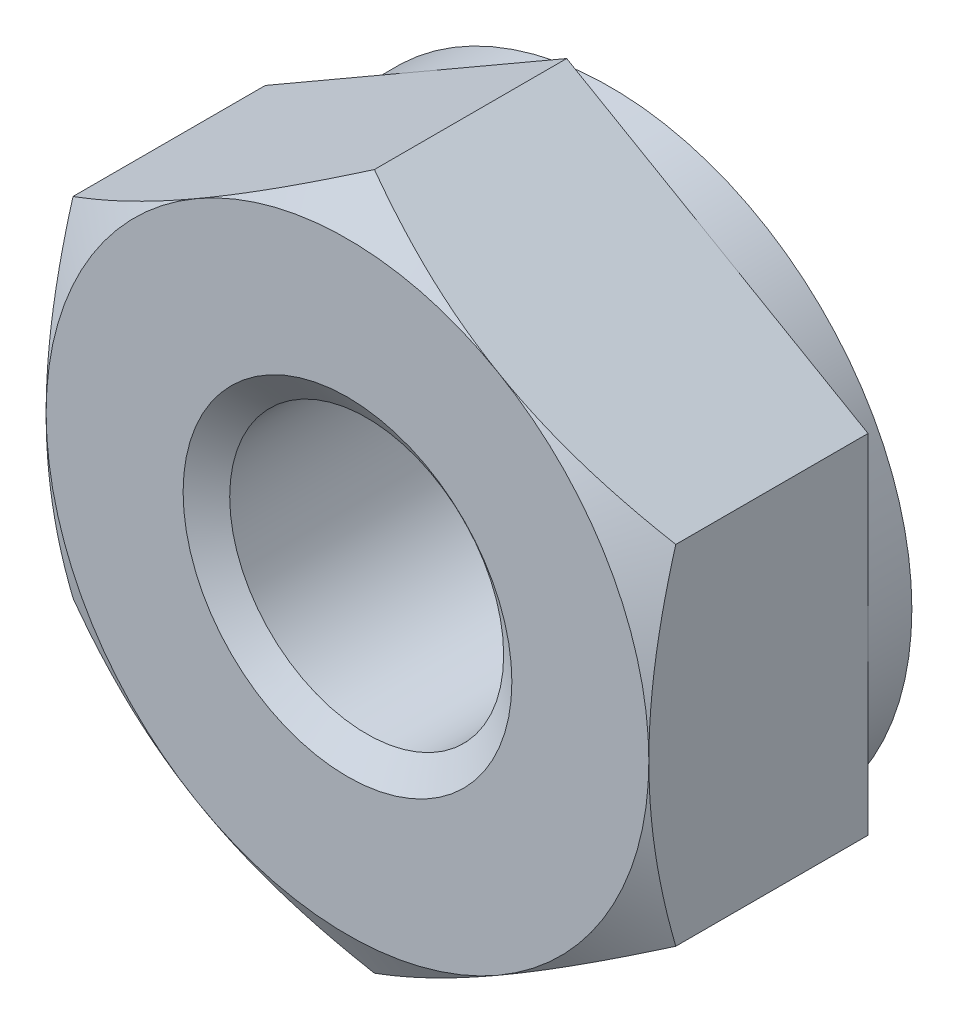
ISO-10303-21;
HEADER;
FILE_DESCRIPTION(('STEP AP214'),'2;1');
FILE_NAME('part.step','',(''),(''),'','','');
FILE_SCHEMA(('AUTOMOTIVE_DESIGN { 1 0 10303 214 1 1 1 1 }'));
ENDSEC;
DATA;
#1=APPLICATION_CONTEXT('core data for automotive mechanical design processes');
#2=APPLICATION_PROTOCOL_DEFINITION('international standard','automotive_design',2000,#1);
#3=PRODUCT_CONTEXT('',#1,'mechanical');
#4=PRODUCT('Part','Part','',(#3));
#5=PRODUCT_RELATED_PRODUCT_CATEGORY('part','',(#4));
#6=PRODUCT_DEFINITION_FORMATION('','',#4);
#7=PRODUCT_DEFINITION_CONTEXT('part definition',#1,'design');
#8=PRODUCT_DEFINITION('design','',#6,#7);
#9=PRODUCT_DEFINITION_SHAPE('','',#8);
#10=(LENGTH_UNIT() NAMED_UNIT(*) SI_UNIT(.MILLI.,.METRE.));
#11=(NAMED_UNIT(*) PLANE_ANGLE_UNIT() SI_UNIT($,.RADIAN.));
#12=(NAMED_UNIT(*) SI_UNIT($,.STERADIAN.) SOLID_ANGLE_UNIT());
#13=UNCERTAINTY_MEASURE_WITH_UNIT(LENGTH_MEASURE(1.E-05),#10,'distance_accuracy_value','');
#14=(GEOMETRIC_REPRESENTATION_CONTEXT(3) GLOBAL_UNCERTAINTY_ASSIGNED_CONTEXT((#13)) GLOBAL_UNIT_ASSIGNED_CONTEXT((#10,
#11,#12)) REPRESENTATION_CONTEXT('',''));
#15=CARTESIAN_POINT('',(0.,0.,0.));
#16=DIRECTION('',(0.,0.,1.));
#17=DIRECTION('',(1.,0.,0.));
#18=AXIS2_PLACEMENT_3D('',#15,#16,#17);
#19=CARTESIAN_POINT('',(0.,0.,-2.4));
#20=DIRECTION('',(0.,0.,1.));
#21=DIRECTION('',(1.,0.,0.));
#22=AXIS2_PLACEMENT_3D('',#19,#20,#21);
#23=CYLINDRICAL_SURFACE('',#22,1.25);
#24=CARTESIAN_POINT('',(0.,0.,-0.175051884552426));
#25=DIRECTION('',(0.,0.,1.));
#26=DIRECTION('',(1.,0.,0.));
#27=AXIS2_PLACEMENT_3D('',#24,#25,#26);
#28=CIRCLE('',#27,1.25);
#29=CARTESIAN_POINT('',(1.25,0.,-0.175051884552426));
#30=VERTEX_POINT('',#29);
#31=EDGE_CURVE('E152',#30,#30,#28,.F.);
#32=ORIENTED_EDGE('',*,*,#31,.F.);
#33=EDGE_LOOP('',(#32));
#34=FACE_BOUND('',#33,.T.);
#35=CARTESIAN_POINT('',(0.,0.,-2.19954811544757));
#36=DIRECTION('',(0.,0.,-1.));
#37=DIRECTION('',(-1.,0.,0.));
#38=AXIS2_PLACEMENT_3D('',#35,#36,#37);
#39=CIRCLE('',#38,1.25);
#40=CARTESIAN_POINT('',(-1.25,0.,-2.19954811544757));
#41=VERTEX_POINT('',#40);
#42=EDGE_CURVE('E40',#41,#41,#39,.F.);
#43=ORIENTED_EDGE('',*,*,#42,.F.);
#44=EDGE_LOOP('',(#43));
#45=FACE_BOUND('',#44,.T.);
#46=ADVANCED_FACE('F35',(#34,#45),#23,.F.);
#47=CARTESIAN_POINT('',(0.,3.17542648054294,-2.4));
#48=DIRECTION('',(-0.500000000000001,0.866025403784438,0.));
#49=DIRECTION('',(-0.866025403784438,-0.500000000000001,0.));
#50=AXIS2_PLACEMENT_3D('',#47,#48,#49);
#51=PLANE('',#50);
#52=DIRECTION('',(0.,0.,1.));
#53=VECTOR('',#52,1.);
#54=CARTESIAN_POINT('',(-2.75,1.58771324027147,-2.4));
#55=LINE('',#54,#53);
#56=CARTESIAN_POINT('',(-2.75,1.58771324027147,-2.));
#57=VERTEX_POINT('',#56);
#58=CARTESIAN_POINT('',(-2.75,1.58771324027147,-0.245620093061864));
#59=VERTEX_POINT('',#58);
#60=EDGE_CURVE('E290',#57,#59,#55,.T.);
#61=ORIENTED_EDGE('',*,*,#60,.T.);
#62=CARTESIAN_POINT('',(-2.7502,1.58759777021763,-0.245686763364761));
#63=CARTESIAN_POINT('',(-2.62935077934009,1.65737010029698,-0.205387662249264));
#64=CARTESIAN_POINT('',(-2.50745839737737,1.72774469983533,-0.168736902597662));
#65=CARTESIAN_POINT('',(-2.26156287327211,1.86971254687003,-0.104762182969801));
#66=CARTESIAN_POINT('',(-2.13755536142614,1.94130831721583,-0.077460855674497));
#67=CARTESIAN_POINT('',(-1.89107720202406,2.08361254889599,-0.0349617452941163));
#68=CARTESIAN_POINT('',(-1.76864448141258,2.15429911309864,-0.0194811186224573));
#69=CARTESIAN_POINT('',(-1.52320285763108,2.29600490065923,-0.000999397369939996));
#70=CARTESIAN_POINT('',(-1.40019484676709,2.36702360884404,0.00201700053740086));
#71=CARTESIAN_POINT('',(-1.17034121338921,2.49972966594897,-0.00425314542854626));
#72=CARTESIAN_POINT('',(-1.06346120874598,2.56143686540073,-0.0120001542767021));
#73=CARTESIAN_POINT('',(-0.85039753266525,2.68444923614047,-0.0365551810643548));
#74=CARTESIAN_POINT('',(-0.744214598351111,2.74575398185008,-0.0533715896505704));
#75=CARTESIAN_POINT('',(-0.530711510606816,2.86902004703206,-0.0954119223459566));
#76=CARTESIAN_POINT('',(-0.423418383857145,2.93096576264318,-0.120814080687231));
#77=CARTESIAN_POINT('',(-0.210432520715949,3.05393320806134,-0.178467225839983));
#78=CARTESIAN_POINT('',(-0.104737054973347,3.11495651365995,-0.210704663298983));
#79=CARTESIAN_POINT('',(0.000199999999999481,3.17554195059678,-0.245686763364762));
#80=B_SPLINE_CURVE_WITH_KNOTS('',3,(#62,#63,#64,#65,#66,#67,#68,#69,#70,#71,#72,#73,#74,#75,#76,
#77,#78,#79),.UNSPECIFIED.,.F.,.F.,(4,2,2,2,2,2,2,2,4),(0.,0.435912828725888,0.872873557116333,
1.29901931904672,1.72464171213574,2.09526089052938,2.46622354066374,2.84541551798557,
3.22386274754524),.UNSPECIFIED.);
#81=CARTESIAN_POINT('',(-1.375,2.38156986040721,0.));
#82=VERTEX_POINT('',#81);
#83=EDGE_CURVE('E138',#59,#82,#80,.T.);
#84=ORIENTED_EDGE('',*,*,#83,.T.);
#85=CARTESIAN_POINT('',(0.,3.17542648054294,-0.245620093061864));
#86=VERTEX_POINT('',#85);
#87=EDGE_CURVE('E165',#82,#86,#80,.T.);
#88=ORIENTED_EDGE('',*,*,#87,.T.);
#89=DIRECTION('',(0.,0.,1.));
#90=VECTOR('',#89,1.);
#91=CARTESIAN_POINT('',(0.,3.17542648054294,-2.4));
#92=LINE('',#91,#90);
#93=CARTESIAN_POINT('',(0.,3.17542648054294,-2.));
#94=VERTEX_POINT('',#93);
#95=EDGE_CURVE('E278',#94,#86,#92,.T.);
#96=ORIENTED_EDGE('',*,*,#95,.F.);
#97=DIRECTION('',(-0.866025403784438,-0.500000000000001,0.));
#98=VECTOR('',#97,1.);
#99=CARTESIAN_POINT('',(0.,3.17542648054294,-2.));
#100=LINE('',#99,#98);
#101=CARTESIAN_POINT('',(-1.375,2.3815698604072,-2.));
#102=VERTEX_POINT('',#101);
#103=EDGE_CURVE('E266',#94,#102,#100,.T.);
#104=ORIENTED_EDGE('',*,*,#103,.T.);
#105=EDGE_CURVE('E262',#102,#57,#100,.T.);
#106=ORIENTED_EDGE('',*,*,#105,.T.);
#107=EDGE_LOOP('',(#61,#84,#88,#96,#104,#106));
#108=FACE_BOUND('',#107,.T.);
#109=ADVANCED_FACE('F37',(#108),#51,.T.);
#110=CARTESIAN_POINT('',(2.75,1.58771324027147,-2.4));
#111=DIRECTION('',(0.5,0.866025403784439,0.));
#112=DIRECTION('',(-0.866025403784439,0.5,0.));
#113=AXIS2_PLACEMENT_3D('',#110,#111,#112);
#114=PLANE('',#113);
#115=ORIENTED_EDGE('',*,*,#95,.T.);
#116=CARTESIAN_POINT('',(-0.000200000000000393,3.17554195059678,-0.245686763364762));
#117=CARTESIAN_POINT('',(0.120649220659906,3.10576962051743,-0.205387662249264));
#118=CARTESIAN_POINT('',(0.242541602622633,3.03539502097908,-0.168736902597663));
#119=CARTESIAN_POINT('',(0.488437126727892,2.89342717394439,-0.104762182969801));
#120=CARTESIAN_POINT('',(0.612444638573856,2.82183140359858,-0.0774608556744977));
#121=CARTESIAN_POINT('',(0.858922797975944,2.67952717191842,-0.0349617452941169));
#122=CARTESIAN_POINT('',(0.981355518587418,2.60884060771577,-0.0194811186224577));
#123=CARTESIAN_POINT('',(1.22679714236892,2.46713482015518,-0.000999397369940226));
#124=CARTESIAN_POINT('',(1.34980515323291,2.39611611197038,0.0020170005374006));
#125=CARTESIAN_POINT('',(1.57965878661079,2.26341005486544,-0.00425314542854649));
#126=CARTESIAN_POINT('',(1.68653879125402,2.20170285541369,-0.0120001542767023));
#127=CARTESIAN_POINT('',(1.89960246733475,2.07869048467395,-0.0365551810643548));
#128=CARTESIAN_POINT('',(2.00578540164889,2.01738573896433,-0.0533715896505703));
#129=CARTESIAN_POINT('',(2.21928848939318,1.89411967378235,-0.0954119223459566));
#130=CARTESIAN_POINT('',(2.32658161614286,1.83217395817123,-0.120814080687231));
#131=CARTESIAN_POINT('',(2.53956747928405,1.70920651275308,-0.178467225839983));
#132=CARTESIAN_POINT('',(2.64526294502665,1.64818320715446,-0.210704663298983));
#133=CARTESIAN_POINT('',(2.7502,1.58759777021763,-0.245686763364761));
#134=B_SPLINE_CURVE_WITH_KNOTS('',3,(#116,#117,#118,#119,#120,#121,#122,#123,#124,#125,#126,
#127,#128,#129,#130,#131,#132,#133),.UNSPECIFIED.,.F.,.F.,(4,2,2,2,2,2,2,2,4),(0.,
0.435912828725889,0.872873557116333,1.29901931904672,1.72464171213574,2.09526089052938,
2.46622354066375,2.84541551798557,3.22386274754524),.UNSPECIFIED.);
#135=CARTESIAN_POINT('',(1.375,2.38156986040721,0.));
#136=VERTEX_POINT('',#135);
#137=EDGE_CURVE('E161',#86,#136,#134,.T.);
#138=ORIENTED_EDGE('',*,*,#137,.T.);
#139=CARTESIAN_POINT('',(2.75,1.58771324027147,-0.245620093061864));
#140=VERTEX_POINT('',#139);
#141=EDGE_CURVE('E147',#136,#140,#134,.T.);
#142=ORIENTED_EDGE('',*,*,#141,.T.);
#143=DIRECTION('',(0.,0.,1.));
#144=VECTOR('',#143,1.);
#145=CARTESIAN_POINT('',(2.75,1.58771324027147,-2.4));
#146=LINE('',#145,#144);
#147=CARTESIAN_POINT('',(2.75,1.58771324027147,-2.));
#148=VERTEX_POINT('',#147);
#149=EDGE_CURVE('E160',#148,#140,#146,.T.);
#150=ORIENTED_EDGE('',*,*,#149,.F.);
#151=DIRECTION('',(-0.866025403784439,0.5,0.));
#152=VECTOR('',#151,1.);
#153=CARTESIAN_POINT('',(2.75,1.58771324027147,-2.));
#154=LINE('',#153,#152);
#155=CARTESIAN_POINT('',(1.375,2.38156986040721,-2.));
#156=VERTEX_POINT('',#155);
#157=EDGE_CURVE('E274',#148,#156,#154,.T.);
#158=ORIENTED_EDGE('',*,*,#157,.T.);
#159=EDGE_CURVE('E270',#156,#94,#154,.T.);
#160=ORIENTED_EDGE('',*,*,#159,.T.);
#161=EDGE_LOOP('',(#115,#138,#142,#150,#158,#160));
#162=FACE_BOUND('',#161,.T.);
#163=ADVANCED_FACE('F237',(#162),#114,.T.);
#164=CARTESIAN_POINT('',(2.75,1.58771324027147,-2.4));
#165=DIRECTION('',(-1.,0.,0.));
#166=DIRECTION('',(0.,0.,1.));
#167=AXIS2_PLACEMENT_3D('',#164,#165,#166);
#168=PLANE('',#167);
#169=CARTESIAN_POINT('',(2.75,-4.21084949309676,-1.31594843960294));
#170=CARTESIAN_POINT('',(2.75,-4.0901089421409,-1.25759993615224));
#171=CARTESIAN_POINT('',(2.75,-3.96908292065509,-1.19983146511759));
#172=CARTESIAN_POINT('',(2.75,-3.72630558284843,-1.08578603842305));
#173=CARTESIAN_POINT('',(2.75,-3.604554145362,-1.02950934100247));
#174=CARTESIAN_POINT('',(2.75,-3.35951393034354,-0.918482443352757));
#175=CARTESIAN_POINT('',(2.75,-3.23622034236436,-0.863742821605838));
#176=CARTESIAN_POINT('',(2.75,-2.98861980138743,-0.756614777476454));
#177=CARTESIAN_POINT('',(2.75,-2.86431290161182,-0.704226232536763));
#178=CARTESIAN_POINT('',(2.75,-2.61294485887172,-0.601803572146123));
#179=CARTESIAN_POINT('',(2.75,-2.48586863815654,-0.551806257898393));
#180=CARTESIAN_POINT('',(2.75,-2.23021732171541,-0.455727408784601));
#181=CARTESIAN_POINT('',(2.75,-2.10164206103363,-0.409646309576971));
#182=CARTESIAN_POINT('',(2.75,-1.84305218799467,-0.322638077046231));
#183=CARTESIAN_POINT('',(2.75,-1.71304130052583,-0.281699986413888));
#184=CARTESIAN_POINT('',(2.75,-1.45117125062147,-0.206307307624348));
#185=CARTESIAN_POINT('',(2.75,-1.31931268690202,-0.171850669152767));
#186=CARTESIAN_POINT('',(2.75,-1.05365722480012,-0.111093671530904));
#187=CARTESIAN_POINT('',(2.75,-0.91985982021759,-0.0847954840951211));
#188=CARTESIAN_POINT('',(2.75,-0.650651874037379,-0.0421260371966109));
#189=CARTESIAN_POINT('',(2.75,-0.515241331013593,-0.025754786510543));
#190=CARTESIAN_POINT('',(2.75,-0.244373242869209,-0.00438749654023752));
#191=CARTESIAN_POINT('',(2.75,-0.108921526377132,0.000680556773215963));
#192=CARTESIAN_POINT('',(2.75,0.161887058855136,-0.000827795632672015));
#193=CARTESIAN_POINT('',(2.75,0.297243943089642,-0.00740117868555385));
#194=CARTESIAN_POINT('',(2.75,0.528385436717545,-0.0281041300468441));
#195=CARTESIAN_POINT('',(2.75,0.624425050137503,-0.0395376410301885));
#196=CARTESIAN_POINT('',(2.75,0.815762399811546,-0.0675217196133514));
#197=CARTESIAN_POINT('',(2.75,0.911060016631968,-0.0840730942276827));
#198=CARTESIAN_POINT('',(2.75,1.19576218748917,-0.140535361278285));
#199=CARTESIAN_POINT('',(2.75,1.38383224738497,-0.187239859417294));
#200=CARTESIAN_POINT('',(2.75,1.66525048947485,-0.267792497030579));
#201=CARTESIAN_POINT('',(2.75,1.76006556248558,-0.296803334995502));
#202=CARTESIAN_POINT('',(2.75,1.94870609382215,-0.357695648906589));
#203=CARTESIAN_POINT('',(2.75,2.04253218553696,-0.389575144878505));
#204=CARTESIAN_POINT('',(2.75,2.22880240354985,-0.455541418186449));
#205=CARTESIAN_POINT('',(2.75,2.32125133588452,-0.489614761455534));
#206=CARTESIAN_POINT('',(2.75,2.50543192042629,-0.559761368231111));
#207=CARTESIAN_POINT('',(2.75,2.59716326539579,-0.595835440037319));
#208=CARTESIAN_POINT('',(2.75,2.68856293053346,-0.632712441997485));
#209=B_SPLINE_CURVE_WITH_KNOTS('',3,(#169,#170,#171,#172,#173,#174,#175,#176,#177,#178,#179,
#180,#181,#182,#183,#184,#185,#186,#187,#188,#189,#190,#191,#192,#193,#194,#195,#196,#197,#198,
#199,#200,#201,#202,#203,#204,#205,#206,#207,#208),.UNSPECIFIED.,.F.,.F.,(4,2,2,2,2,2,2,2,2,2,2,
2,2,2,2,2,2,2,2,4),(0.,0.402305607365937,0.804680408536998,1.20935783819118,1.61401414820818,
2.0236383818577,2.43330812457349,2.842089694796,3.25074173456636,3.65950246109143,
4.06826354901184,4.4744128402465,4.88045669141172,5.17046846817546,5.46052599902452,
6.04107275309883,6.33851131304661,6.63574613017455,6.93130791005792,7.22698998004823),.UNSPECIFIED.);
#210=CARTESIAN_POINT('',(2.75,-1.58771324027147,-0.245620093061864));
#211=VERTEX_POINT('',#210);
#212=CARTESIAN_POINT('',(2.75,0.,0.));
#213=VERTEX_POINT('',#212);
#214=EDGE_CURVE('E127',#211,#213,#209,.T.);
#215=ORIENTED_EDGE('',*,*,#214,.F.);
#216=DIRECTION('',(0.,0.,1.));
#217=VECTOR('',#216,1.);
#218=CARTESIAN_POINT('',(2.75,-1.58771324027147,-2.4));
#219=LINE('',#218,#217);
#220=CARTESIAN_POINT('',(2.75,-1.58771324027147,-2.));
#221=VERTEX_POINT('',#220);
#222=EDGE_CURVE('E283',#221,#211,#219,.T.);
#223=ORIENTED_EDGE('',*,*,#222,.F.);
#224=DIRECTION('',(0.,-1.,0.));
#225=VECTOR('',#224,1.);
#226=CARTESIAN_POINT('',(2.75,1.58771324027147,-2.));
#227=LINE('',#226,#225);
#228=CARTESIAN_POINT('',(2.75,0.,-2.));
#229=VERTEX_POINT('',#228);
#230=EDGE_CURVE('E275',#229,#221,#227,.T.);
#231=ORIENTED_EDGE('',*,*,#230,.F.);
#232=EDGE_CURVE('E277',#148,#229,#227,.T.);
#233=ORIENTED_EDGE('',*,*,#232,.F.);
#234=ORIENTED_EDGE('',*,*,#149,.T.);
#235=EDGE_CURVE('E140',#213,#140,#209,.T.);
#236=ORIENTED_EDGE('',*,*,#235,.F.);
#237=EDGE_LOOP('',(#215,#223,#231,#233,#234,#236));
#238=FACE_BOUND('',#237,.T.);
#239=ADVANCED_FACE('F157',(#238),#168,.F.);
#240=CARTESIAN_POINT('',(0.,-3.17542648054295,-2.4));
#241=DIRECTION('',(0.500000000000001,-0.866025403784438,0.));
#242=DIRECTION('',(0.866025403784438,0.500000000000001,0.));
#243=AXIS2_PLACEMENT_3D('',#240,#241,#242);
#244=PLANE('',#243);
#245=ORIENTED_EDGE('',*,*,#222,.T.);
#246=CARTESIAN_POINT('',(2.7502,-1.58759777021763,-0.245686763364761));
#247=CARTESIAN_POINT('',(2.62935077934009,-1.65737010029699,-0.205387662249264));
#248=CARTESIAN_POINT('',(2.50745839737737,-1.72774469983533,-0.168736902597663));
#249=CARTESIAN_POINT('',(2.26156287327211,-1.86971254687003,-0.104762182969802));
#250=CARTESIAN_POINT('',(2.13755536142614,-1.94130831721583,-0.0774608556744979));
#251=CARTESIAN_POINT('',(1.89107720202406,-2.08361254889599,-0.0349617452941172));
#252=CARTESIAN_POINT('',(1.76864448141258,-2.15429911309864,-0.0194811186224582));
#253=CARTESIAN_POINT('',(1.52320285763108,-2.29600490065923,-0.000999397369941026));
#254=CARTESIAN_POINT('',(1.40019484676709,-2.36702360884404,0.00201700053739964));
#255=CARTESIAN_POINT('',(1.17034121338921,-2.49972966594897,-0.00425314542854765));
#256=CARTESIAN_POINT('',(1.06346120874598,-2.56143686540073,-0.0120001542767035));
#257=CARTESIAN_POINT('',(0.85039753266525,-2.68444923614047,-0.0365551810643563));
#258=CARTESIAN_POINT('',(0.744214598351111,-2.74575398185008,-0.0533715896505721));
#259=CARTESIAN_POINT('',(0.530711510606816,-2.86902004703207,-0.0954119223459584));
#260=CARTESIAN_POINT('',(0.423418383857145,-2.93096576264319,-0.120814080687233));
#261=CARTESIAN_POINT('',(0.210432520715949,-3.05393320806134,-0.178467225839984));
#262=CARTESIAN_POINT('',(0.104737054973348,-3.11495651365995,-0.210704663298985));
#263=CARTESIAN_POINT('',(-0.000199999999999358,-3.17554195059678,-0.245686763364763));
#264=B_SPLINE_CURVE_WITH_KNOTS('',3,(#246,#247,#248,#249,#250,#251,#252,#253,#254,#255,#256,
#257,#258,#259,#260,#261,#262,#263),.UNSPECIFIED.,.F.,.F.,(4,2,2,2,2,2,2,2,4),(0.,
0.435912828725889,0.872873557116333,1.29901931904672,1.72464171213574,2.09526089052938,
2.46622354066374,2.84541551798557,3.22386274754524),.UNSPECIFIED.);
#265=CARTESIAN_POINT('',(1.375,-2.38156986040721,0.));
#266=VERTEX_POINT('',#265);
#267=EDGE_CURVE('E133',#211,#266,#264,.T.);
#268=ORIENTED_EDGE('',*,*,#267,.T.);
#269=CARTESIAN_POINT('',(0.,-3.17542648054294,-0.245620093061864));
#270=VERTEX_POINT('',#269);
#271=EDGE_CURVE('E54',#266,#270,#264,.T.);
#272=ORIENTED_EDGE('',*,*,#271,.T.);
#273=DIRECTION('',(0.,0.,1.));
#274=VECTOR('',#273,1.);
#275=CARTESIAN_POINT('',(0.,-3.17542648054295,-2.4));
#276=LINE('',#275,#274);
#277=CARTESIAN_POINT('',(0.,-3.17542648054295,-2.));
#278=VERTEX_POINT('',#277);
#279=EDGE_CURVE('E285',#278,#270,#276,.T.);
#280=ORIENTED_EDGE('',*,*,#279,.F.);
#281=DIRECTION('',(0.866025403784438,0.500000000000001,0.));
#282=VECTOR('',#281,1.);
#283=CARTESIAN_POINT('',(0.,-3.17542648054295,-2.));
#284=LINE('',#283,#282);
#285=CARTESIAN_POINT('',(1.375,-2.38156986040721,-2.));
#286=VERTEX_POINT('',#285);
#287=EDGE_CURVE('E267',#278,#286,#284,.T.);
#288=ORIENTED_EDGE('',*,*,#287,.T.);
#289=EDGE_CURVE('E271',#286,#221,#284,.T.);
#290=ORIENTED_EDGE('',*,*,#289,.T.);
#291=EDGE_LOOP('',(#245,#268,#272,#280,#288,#290));
#292=FACE_BOUND('',#291,.T.);
#293=ADVANCED_FACE('F218',(#292),#244,.T.);
#294=CARTESIAN_POINT('',(-2.75,-1.58771324027147,-2.4));
#295=DIRECTION('',(-0.5,-0.866025403784439,0.));
#296=DIRECTION('',(0.866025403784439,-0.5,0.));
#297=AXIS2_PLACEMENT_3D('',#294,#295,#296);
#298=PLANE('',#297);
#299=ORIENTED_EDGE('',*,*,#279,.T.);
#300=CARTESIAN_POINT('',(0.000200000000000501,-3.17554195059678,-0.245686763364763));
#301=CARTESIAN_POINT('',(-0.120649220659906,-3.10576962051743,-0.205387662249265));
#302=CARTESIAN_POINT('',(-0.242541602622633,-3.03539502097908,-0.168736902597664));
#303=CARTESIAN_POINT('',(-0.488437126727893,-2.89342717394439,-0.104762182969802));
#304=CARTESIAN_POINT('',(-0.612444638573856,-2.82183140359859,-0.0774608556744989));
#305=CARTESIAN_POINT('',(-0.858922797975945,-2.67952717191843,-0.0349617452941181));
#306=CARTESIAN_POINT('',(-0.981355518587418,-2.60884060771577,-0.019481118622459));
#307=CARTESIAN_POINT('',(-1.22679714236892,-2.46713482015519,-0.000999397369941588));
#308=CARTESIAN_POINT('',(-1.34980515323291,-2.39611611197038,0.0020170005373991));
#309=CARTESIAN_POINT('',(-1.57965878661079,-2.26341005486544,-0.00425314542854787));
#310=CARTESIAN_POINT('',(-1.68653879125402,-2.20170285541369,-0.0120001542767034));
#311=CARTESIAN_POINT('',(-1.89960246733475,-2.07869048467395,-0.0365551810643559));
#312=CARTESIAN_POINT('',(-2.00578540164889,-2.01738573896434,-0.0533715896505716));
#313=CARTESIAN_POINT('',(-2.21928848939318,-1.89411967378235,-0.0954119223459577));
#314=CARTESIAN_POINT('',(-2.32658161614286,-1.83217395817123,-0.120814080687232));
#315=CARTESIAN_POINT('',(-2.53956747928405,-1.70920651275308,-0.178467225839983));
#316=CARTESIAN_POINT('',(-2.64526294502665,-1.64818320715446,-0.210704663298984));
#317=CARTESIAN_POINT('',(-2.7502,-1.58759777021764,-0.245686763364762));
#318=B_SPLINE_CURVE_WITH_KNOTS('',3,(#300,#301,#302,#303,#304,#305,#306,#307,#308,#309,#310,
#311,#312,#313,#314,#315,#316,#317),.UNSPECIFIED.,.F.,.F.,(4,2,2,2,2,2,2,2,4),(0.,
0.435912828725889,0.872873557116334,1.29901931904672,1.72464171213574,2.09526089052938,
2.46622354066374,2.84541551798557,3.22386274754524),.UNSPECIFIED.);
#319=CARTESIAN_POINT('',(-1.375,-2.38156986040721,0.));
#320=VERTEX_POINT('',#319);
#321=EDGE_CURVE('E212',#270,#320,#318,.T.);
#322=ORIENTED_EDGE('',*,*,#321,.T.);
#323=CARTESIAN_POINT('',(-2.75,-1.58771324027147,-0.245620093061864));
#324=VERTEX_POINT('',#323);
#325=EDGE_CURVE('E61',#320,#324,#318,.T.);
#326=ORIENTED_EDGE('',*,*,#325,.T.);
#327=DIRECTION('',(0.,0.,1.));
#328=VECTOR('',#327,1.);
#329=CARTESIAN_POINT('',(-2.75,-1.58771324027147,-2.4));
#330=LINE('',#329,#328);
#331=CARTESIAN_POINT('',(-2.75,-1.58771324027147,-2.));
#332=VERTEX_POINT('',#331);
#333=EDGE_CURVE('E288',#332,#324,#330,.T.);
#334=ORIENTED_EDGE('',*,*,#333,.F.);
#335=DIRECTION('',(0.866025403784439,-0.5,0.));
#336=VECTOR('',#335,1.);
#337=CARTESIAN_POINT('',(-2.75,-1.58771324027147,-2.));
#338=LINE('',#337,#336);
#339=CARTESIAN_POINT('',(-1.375,-2.38156986040721,-2.));
#340=VERTEX_POINT('',#339);
#341=EDGE_CURVE('E257',#332,#340,#338,.T.);
#342=ORIENTED_EDGE('',*,*,#341,.T.);
#343=EDGE_CURVE('E263',#340,#278,#338,.T.);
#344=ORIENTED_EDGE('',*,*,#343,.T.);
#345=EDGE_LOOP('',(#299,#322,#326,#334,#342,#344));
#346=FACE_BOUND('',#345,.T.);
#347=ADVANCED_FACE('F214',(#346),#298,.T.);
#348=CARTESIAN_POINT('',(-2.75,1.58771324027147,-2.4));
#349=DIRECTION('',(-1.,0.,0.));
#350=DIRECTION('',(0.,0.,1.));
#351=AXIS2_PLACEMENT_3D('',#348,#349,#350);
#352=PLANE('',#351);
#353=ORIENTED_EDGE('',*,*,#333,.T.);
#354=CARTESIAN_POINT('',(-2.75,-4.21084949309676,-1.31594843960294));
#355=CARTESIAN_POINT('',(-2.75,-4.0901089421409,-1.25759993615224));
#356=CARTESIAN_POINT('',(-2.75,-3.96908292065509,-1.19983146511759));
#357=CARTESIAN_POINT('',(-2.75,-3.72630558284844,-1.08578603842305));
#358=CARTESIAN_POINT('',(-2.75,-3.604554145362,-1.02950934100247));
#359=CARTESIAN_POINT('',(-2.75,-3.35951393034355,-0.918482443352758));
#360=CARTESIAN_POINT('',(-2.75,-3.23622034236436,-0.863742821605839));
#361=CARTESIAN_POINT('',(-2.75,-2.98861980138743,-0.756614777476455));
#362=CARTESIAN_POINT('',(-2.75,-2.86431290161182,-0.704226232536764));
#363=CARTESIAN_POINT('',(-2.75,-2.61294485887172,-0.601803572146124));
#364=CARTESIAN_POINT('',(-2.75,-2.48586863815654,-0.551806257898394));
#365=CARTESIAN_POINT('',(-2.75,-2.23021732171541,-0.455727408784601));
#366=CARTESIAN_POINT('',(-2.75,-2.10164206103363,-0.409646309576972));
#367=CARTESIAN_POINT('',(-2.75,-1.84305218799467,-0.322638077046231));
#368=CARTESIAN_POINT('',(-2.75,-1.71304130052583,-0.281699986413888));
#369=CARTESIAN_POINT('',(-2.75,-1.45117125062148,-0.206307307624348));
#370=CARTESIAN_POINT('',(-2.75,-1.31931268690202,-0.171850669152767));
#371=CARTESIAN_POINT('',(-2.75,-1.05365722480012,-0.111093671530904));
#372=CARTESIAN_POINT('',(-2.75,-0.919859820217591,-0.0847954840951213));
#373=CARTESIAN_POINT('',(-2.75,-0.65065187403738,-0.0421260371966111));
#374=CARTESIAN_POINT('',(-2.75,-0.515241331013594,-0.0257547865105431));
#375=CARTESIAN_POINT('',(-2.75,-0.24437324286921,-0.00438749654023746));
#376=CARTESIAN_POINT('',(-2.75,-0.108921526377132,0.000680556773216002));
#377=CARTESIAN_POINT('',(-2.75,0.161887058855135,-0.000827795632672053));
#378=CARTESIAN_POINT('',(-2.75,0.297243943089641,-0.00740117868555392));
#379=CARTESIAN_POINT('',(-2.75,0.528385436717543,-0.028104130046844));
#380=CARTESIAN_POINT('',(-2.75,0.624425050137501,-0.0395376410301884));
#381=CARTESIAN_POINT('',(-2.75,0.815762399811544,-0.067521719613351));
#382=CARTESIAN_POINT('',(-2.75,0.911060016631966,-0.0840730942276823));
#383=CARTESIAN_POINT('',(-2.75,1.19576218748916,-0.140535361278284));
#384=CARTESIAN_POINT('',(-2.75,1.38383224738497,-0.187239859417294));
#385=CARTESIAN_POINT('',(-2.75,1.66525048947485,-0.267792497030578));
#386=CARTESIAN_POINT('',(-2.75,1.76006556248558,-0.296803334995501));
#387=CARTESIAN_POINT('',(-2.75,1.94870609382215,-0.357695648906588));
#388=CARTESIAN_POINT('',(-2.75,2.04253218553696,-0.389575144878503));
#389=CARTESIAN_POINT('',(-2.75,2.22880240354984,-0.455541418186448));
#390=CARTESIAN_POINT('',(-2.75,2.32125133588451,-0.489614761455533));
#391=CARTESIAN_POINT('',(-2.75,2.50543192042629,-0.559761368231109));
#392=CARTESIAN_POINT('',(-2.75,2.59716326539579,-0.595835440037318));
#393=CARTESIAN_POINT('',(-2.75,2.68856293053346,-0.632712441997484));
#394=B_SPLINE_CURVE_WITH_KNOTS('',3,(#354,#355,#356,#357,#358,#359,#360,#361,#362,#363,#364,
#365,#366,#367,#368,#369,#370,#371,#372,#373,#374,#375,#376,#377,#378,#379,#380,#381,#382,#383,
#384,#385,#386,#387,#388,#389,#390,#391,#392,#393),.UNSPECIFIED.,.F.,.F.,(4,2,2,2,2,2,2,2,2,2,2,
2,2,2,2,2,2,2,2,4),(0.,0.402305607365936,0.804680408536997,1.20935783819118,1.61401414820818,
2.0236383818577,2.43330812457349,2.842089694796,3.25074173456636,3.65950246109144,
4.06826354901184,4.4744128402465,4.88045669141172,5.17046846817546,5.46052599902452,
6.04107275309883,6.33851131304661,6.63574613017455,6.93130791005792,7.22698998004822),.UNSPECIFIED.);
#395=CARTESIAN_POINT('',(-2.75,0.,0.));
#396=VERTEX_POINT('',#395);
#397=EDGE_CURVE('E213',#324,#396,#394,.T.);
#398=ORIENTED_EDGE('',*,*,#397,.T.);
#399=EDGE_CURVE('E151',#396,#59,#394,.T.);
#400=ORIENTED_EDGE('',*,*,#399,.T.);
#401=ORIENTED_EDGE('',*,*,#60,.F.);
#402=DIRECTION('',(0.,-1.,0.));
#403=VECTOR('',#402,1.);
#404=CARTESIAN_POINT('',(-2.75,1.58771324027147,-2.));
#405=LINE('',#404,#403);
#406=CARTESIAN_POINT('',(-2.75,0.,-2.));
#407=VERTEX_POINT('',#406);
#408=EDGE_CURVE('E297',#57,#407,#405,.T.);
#409=ORIENTED_EDGE('',*,*,#408,.T.);
#410=EDGE_CURVE('E295',#407,#332,#405,.T.);
#411=ORIENTED_EDGE('',*,*,#410,.T.);
#412=EDGE_LOOP('',(#353,#398,#400,#401,#409,#411));
#413=FACE_BOUND('',#412,.T.);
#414=ADVANCED_FACE('F217',(#413),#352,.T.);
#415=CARTESIAN_POINT('',(-5.5,0.,0.));
#416=DIRECTION('',(0.,0.,1.));
#417=DIRECTION('',(1.,0.,0.));
#418=AXIS2_PLACEMENT_3D('',#415,#416,#417);
#419=PLANE('',#418);
#420=CARTESIAN_POINT('',(0.,0.,0.));
#421=DIRECTION('',(0.,0.,1.));
#422=DIRECTION('',(1.,0.,0.));
#423=AXIS2_PLACEMENT_3D('',#420,#421,#422);
#424=CIRCLE('',#423,1.5);
#425=CARTESIAN_POINT('',(1.5,0.,0.));
#426=VERTEX_POINT('',#425);
#427=EDGE_CURVE('E300',#426,#426,#424,.T.);
#428=ORIENTED_EDGE('',*,*,#427,.F.);
#429=EDGE_LOOP('',(#428));
#430=FACE_BOUND('',#429,.T.);
#431=CARTESIAN_POINT('',(0.,0.,0.));
#432=DIRECTION('',(0.,0.,1.));
#433=DIRECTION('',(1.,0.,0.));
#434=AXIS2_PLACEMENT_3D('',#431,#432,#433);
#435=CIRCLE('',#434,2.75);
#436=EDGE_CURVE('E12',#213,#266,#435,.F.);
#437=ORIENTED_EDGE('',*,*,#436,.F.);
#438=CARTESIAN_POINT('',(0.,0.,0.));
#439=DIRECTION('',(0.,0.,1.));
#440=DIRECTION('',(1.,0.,0.));
#441=AXIS2_PLACEMENT_3D('',#438,#439,#440);
#442=CIRCLE('',#441,2.75);
#443=EDGE_CURVE('E144',#213,#136,#442,.T.);
#444=ORIENTED_EDGE('',*,*,#443,.T.);
#445=EDGE_CURVE('E47',#82,#136,#435,.F.);
#446=ORIENTED_EDGE('',*,*,#445,.F.);
#447=EDGE_CURVE('E365',#396,#82,#435,.F.);
#448=ORIENTED_EDGE('',*,*,#447,.F.);
#449=EDGE_CURVE('E367',#320,#396,#435,.F.);
#450=ORIENTED_EDGE('',*,*,#449,.F.);
#451=EDGE_CURVE('E45',#266,#320,#435,.F.);
#452=ORIENTED_EDGE('',*,*,#451,.F.);
#453=EDGE_LOOP('',(#437,#444,#446,#448,#450,#452));
#454=FACE_BOUND('',#453,.T.);
#455=ADVANCED_FACE('F154',(#430,#454),#419,.T.);
#456=CARTESIAN_POINT('',(-5.5,0.,-2.4));
#457=DIRECTION('',(0.,0.,1.));
#458=DIRECTION('',(1.,0.,0.));
#459=AXIS2_PLACEMENT_3D('',#456,#457,#458);
#460=PLANE('',#459);
#461=CARTESIAN_POINT('',(0.,0.,-2.4));
#462=DIRECTION('',(0.,0.,1.));
#463=DIRECTION('',(1.,0.,0.));
#464=AXIS2_PLACEMENT_3D('',#461,#462,#463);
#465=CIRCLE('',#464,1.5);
#466=CARTESIAN_POINT('',(1.5,0.,-2.4));
#467=VERTEX_POINT('',#466);
#468=EDGE_CURVE('E301',#467,#467,#465,.F.);
#469=ORIENTED_EDGE('',*,*,#468,.F.);
#470=EDGE_LOOP('',(#469));
#471=FACE_BOUND('',#470,.T.);
#472=CARTESIAN_POINT('',(0.,0.,-2.4));
#473=DIRECTION('',(0.,0.,1.));
#474=DIRECTION('',(1.,0.,0.));
#475=AXIS2_PLACEMENT_3D('',#472,#473,#474);
#476=CIRCLE('',#475,2.75);
#477=CARTESIAN_POINT('',(2.75,0.,-2.4));
#478=VERTEX_POINT('',#477);
#479=EDGE_CURVE('E281',#478,#478,#476,.F.);
#480=ORIENTED_EDGE('',*,*,#479,.T.);
#481=EDGE_LOOP('',(#480));
#482=FACE_BOUND('',#481,.T.);
#483=ADVANCED_FACE('F227',(#471,#482),#460,.F.);
#484=CARTESIAN_POINT('',(0.,13.1754264805429,-2.));
#485=DIRECTION('',(0.,0.,-1.));
#486=DIRECTION('',(-1.,0.,0.));
#487=AXIS2_PLACEMENT_3D('',#484,#485,#486);
#488=PLANE('',#487);
#489=ORIENTED_EDGE('',*,*,#232,.T.);
#490=CARTESIAN_POINT('',(0.,0.,-2.));
#491=DIRECTION('',(0.,0.,1.));
#492=DIRECTION('',(1.,0.,0.));
#493=AXIS2_PLACEMENT_3D('',#490,#491,#492);
#494=CIRCLE('',#493,2.75);
#495=EDGE_CURVE('E254',#229,#156,#494,.T.);
#496=ORIENTED_EDGE('',*,*,#495,.T.);
#497=ORIENTED_EDGE('',*,*,#157,.F.);
#498=EDGE_LOOP('',(#489,#496,#497));
#499=FACE_BOUND('',#498,.T.);
#500=ADVANCED_FACE('F244',(#499),#488,.T.);
#501=ORIENTED_EDGE('',*,*,#230,.T.);
#502=ORIENTED_EDGE('',*,*,#289,.F.);
#503=EDGE_CURVE('E259',#286,#229,#494,.T.);
#504=ORIENTED_EDGE('',*,*,#503,.T.);
#505=EDGE_LOOP('',(#501,#502,#504));
#506=FACE_BOUND('',#505,.T.);
#507=ADVANCED_FACE('F343',(#506),#488,.T.);
#508=EDGE_CURVE('E258',#156,#102,#494,.T.);
#509=ORIENTED_EDGE('',*,*,#508,.T.);
#510=ORIENTED_EDGE('',*,*,#103,.F.);
#511=ORIENTED_EDGE('',*,*,#159,.F.);
#512=EDGE_LOOP('',(#509,#510,#511));
#513=FACE_BOUND('',#512,.T.);
#514=ADVANCED_FACE('F351',(#513),#488,.T.);
#515=ORIENTED_EDGE('',*,*,#343,.F.);
#516=EDGE_CURVE('E382',#340,#286,#494,.T.);
#517=ORIENTED_EDGE('',*,*,#516,.T.);
#518=ORIENTED_EDGE('',*,*,#287,.F.);
#519=EDGE_LOOP('',(#515,#517,#518));
#520=FACE_BOUND('',#519,.T.);
#521=ADVANCED_FACE('F346',(#520),#488,.T.);
#522=EDGE_CURVE('E355',#102,#407,#494,.T.);
#523=ORIENTED_EDGE('',*,*,#522,.T.);
#524=ORIENTED_EDGE('',*,*,#408,.F.);
#525=ORIENTED_EDGE('',*,*,#105,.F.);
#526=EDGE_LOOP('',(#523,#524,#525));
#527=FACE_BOUND('',#526,.T.);
#528=ADVANCED_FACE('F337',(#527),#488,.T.);
#529=CARTESIAN_POINT('',(0.,0.,0.));
#530=DIRECTION('',(0.,0.,1.));
#531=DIRECTION('',(1.,0.,0.));
#532=AXIS2_PLACEMENT_3D('',#529,#530,#531);
#533=CYLINDRICAL_SURFACE('',#532,2.75);
#534=ORIENTED_EDGE('',*,*,#479,.F.);
#535=EDGE_LOOP('',(#534));
#536=FACE_BOUND('',#535,.T.);
#537=ORIENTED_EDGE('',*,*,#508,.F.);
#538=ORIENTED_EDGE('',*,*,#495,.F.);
#539=ORIENTED_EDGE('',*,*,#503,.F.);
#540=ORIENTED_EDGE('',*,*,#516,.F.);
#541=EDGE_CURVE('E361',#407,#340,#494,.T.);
#542=ORIENTED_EDGE('',*,*,#541,.F.);
#543=ORIENTED_EDGE('',*,*,#522,.F.);
#544=EDGE_LOOP('',(#537,#538,#539,#540,#542,#543));
#545=FACE_BOUND('',#544,.T.);
#546=ADVANCED_FACE('F242',(#536,#545),#533,.T.);
#547=ORIENTED_EDGE('',*,*,#410,.F.);
#548=ORIENTED_EDGE('',*,*,#541,.T.);
#549=ORIENTED_EDGE('',*,*,#341,.F.);
#550=EDGE_LOOP('',(#547,#548,#549));
#551=FACE_BOUND('',#550,.T.);
#552=ADVANCED_FACE('F195',(#551),#488,.T.);
#553=CARTESIAN_POINT('',(0.,0.,0.));
#554=DIRECTION('',(0.,0.,-1.));
#555=DIRECTION('',(-1.,0.,0.));
#556=AXIS2_PLACEMENT_3D('',#553,#554,#555);
#557=CONICAL_SURFACE('',#556,2.75,1.0471975511966);
#558=ORIENTED_EDGE('',*,*,#443,.F.);
#559=ORIENTED_EDGE('',*,*,#235,.T.);
#560=ORIENTED_EDGE('',*,*,#141,.F.);
#561=EDGE_LOOP('',(#558,#559,#560));
#562=FACE_BOUND('',#561,.T.);
#563=ADVANCED_FACE('F145',(#562),#557,.T.);
#564=ORIENTED_EDGE('',*,*,#445,.T.);
#565=ORIENTED_EDGE('',*,*,#137,.F.);
#566=ORIENTED_EDGE('',*,*,#87,.F.);
#567=EDGE_LOOP('',(#564,#565,#566));
#568=FACE_BOUND('',#567,.T.);
#569=ADVANCED_FACE('F192',(#568),#557,.T.);
#570=ORIENTED_EDGE('',*,*,#399,.F.);
#571=ORIENTED_EDGE('',*,*,#447,.T.);
#572=ORIENTED_EDGE('',*,*,#83,.F.);
#573=EDGE_LOOP('',(#570,#571,#572));
#574=FACE_BOUND('',#573,.T.);
#575=ADVANCED_FACE('F191',(#574),#557,.T.);
#576=ORIENTED_EDGE('',*,*,#449,.T.);
#577=ORIENTED_EDGE('',*,*,#397,.F.);
#578=ORIENTED_EDGE('',*,*,#325,.F.);
#579=EDGE_LOOP('',(#576,#577,#578));
#580=FACE_BOUND('',#579,.T.);
#581=ADVANCED_FACE('F185',(#580),#557,.T.);
#582=ORIENTED_EDGE('',*,*,#451,.T.);
#583=ORIENTED_EDGE('',*,*,#321,.F.);
#584=ORIENTED_EDGE('',*,*,#271,.F.);
#585=EDGE_LOOP('',(#582,#583,#584));
#586=FACE_BOUND('',#585,.T.);
#587=ADVANCED_FACE('F190',(#586),#557,.T.);
#588=ORIENTED_EDGE('',*,*,#214,.T.);
#589=ORIENTED_EDGE('',*,*,#436,.T.);
#590=ORIENTED_EDGE('',*,*,#267,.F.);
#591=EDGE_LOOP('',(#588,#589,#590));
#592=FACE_BOUND('',#591,.T.);
#593=ADVANCED_FACE('F129',(#592),#557,.T.);
#594=CARTESIAN_POINT('',(0.,0.,-0.192557073007669));
#595=DIRECTION('',(0.,0.,1.));
#596=DIRECTION('',(1.,0.,0.));
#597=AXIS2_PLACEMENT_3D('',#594,#595,#596);
#598=CONICAL_SURFACE('',#597,1.225,0.959931088596884);
#599=ORIENTED_EDGE('',*,*,#427,.T.);
#600=EDGE_LOOP('',(#599));
#601=FACE_BOUND('',#600,.T.);
#602=ORIENTED_EDGE('',*,*,#31,.T.);
#603=EDGE_LOOP('',(#602));
#604=FACE_BOUND('',#603,.T.);
#605=ADVANCED_FACE('F193',(#601,#604),#598,.F.);
#606=CARTESIAN_POINT('',(0.,0.,-2.3746));
#607=DIRECTION('',(0.,0.,-1.));
#608=DIRECTION('',(-1.,0.,0.));
#609=AXIS2_PLACEMENT_3D('',#606,#607,#608);
#610=CONICAL_SURFACE('',#609,1.5,0.959931088596876);
#611=CARTESIAN_POINT('',(0.,0.,-2.3746));
#612=DIRECTION('',(0.,0.,1.));
#613=DIRECTION('',(1.,0.,0.));
#614=AXIS2_PLACEMENT_3D('',#611,#612,#613);
#615=CIRCLE('',#614,1.5);
#616=CARTESIAN_POINT('',(1.5,0.,-2.3746));
#617=VERTEX_POINT('',#616);
#618=EDGE_CURVE('E303',#617,#617,#615,.T.);
#619=ORIENTED_EDGE('',*,*,#618,.F.);
#620=EDGE_LOOP('',(#619));
#621=FACE_BOUND('',#620,.T.);
#622=ORIENTED_EDGE('',*,*,#42,.T.);
#623=EDGE_LOOP('',(#622));
#624=FACE_BOUND('',#623,.T.);
#625=ADVANCED_FACE('F317',(#621,#624),#610,.F.);
#626=CARTESIAN_POINT('',(0.,0.,-25.0375057290932));
#627=DIRECTION('',(0.,0.,1.));
#628=DIRECTION('',(1.,0.,0.));
#629=AXIS2_PLACEMENT_3D('',#626,#627,#628);
#630=CYLINDRICAL_SURFACE('',#629,1.5);
#631=ORIENTED_EDGE('',*,*,#618,.T.);
#632=EDGE_LOOP('',(#631));
#633=FACE_BOUND('',#632,.T.);
#634=ORIENTED_EDGE('',*,*,#468,.T.);
#635=EDGE_LOOP('',(#634));
#636=FACE_BOUND('',#635,.T.);
#637=ADVANCED_FACE('F322',(#633,#636),#630,.F.);
#638=CLOSED_SHELL('',(#46,#109,#163,#239,#293,#347,#414,#455,#483,#500,#507,#514,#521,#528,#546,
#552,#563,#569,#575,#581,#587,#593,#605,#625,#637));
#639=MANIFOLD_SOLID_BREP('B2',#638);
#640=ADVANCED_BREP_SHAPE_REPRESENTATION('',(#18,#639),#14);
#641=SHAPE_DEFINITION_REPRESENTATION(#9,#640);
ENDSEC;
END-ISO-10303-21;
